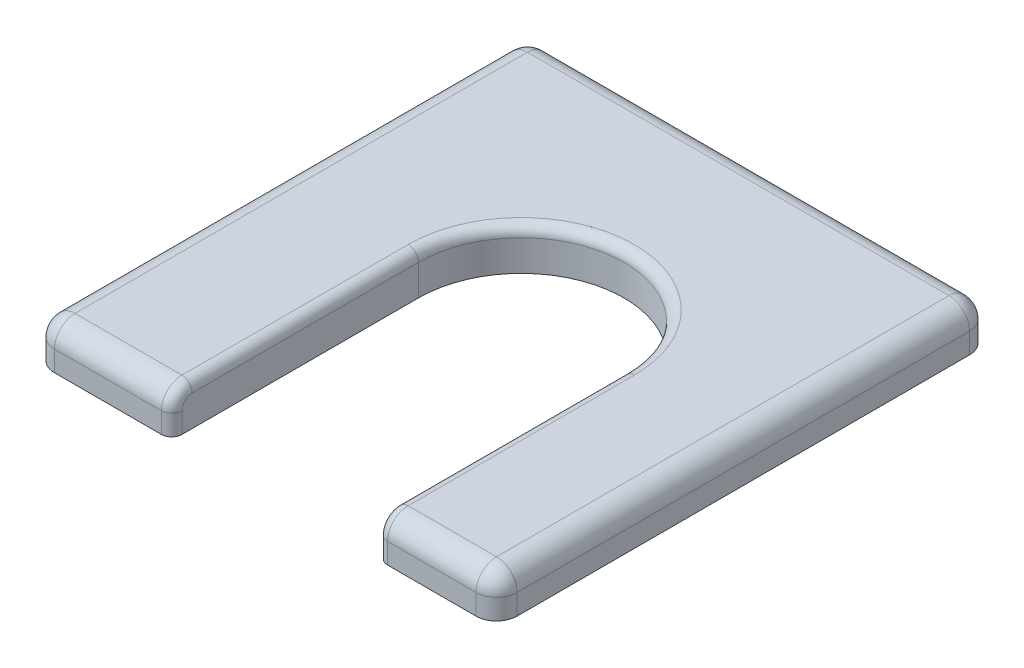
ISO-10303-21;
HEADER;
FILE_DESCRIPTION(('STEP AP214'),'2;1');
FILE_NAME('part.step','',(''),(''),'','','');
FILE_SCHEMA(('AUTOMOTIVE_DESIGN { 1 0 10303 214 1 1 1 1 }'));
ENDSEC;
DATA;
#1=APPLICATION_CONTEXT('core data for automotive mechanical design processes');
#2=APPLICATION_PROTOCOL_DEFINITION('international standard','automotive_design',2000,#1);
#3=PRODUCT_CONTEXT('',#1,'mechanical');
#4=PRODUCT('Part','Part','',(#3));
#5=PRODUCT_RELATED_PRODUCT_CATEGORY('part','',(#4));
#6=PRODUCT_DEFINITION_FORMATION('','',#4);
#7=PRODUCT_DEFINITION_CONTEXT('part definition',#1,'design');
#8=PRODUCT_DEFINITION('design','',#6,#7);
#9=PRODUCT_DEFINITION_SHAPE('','',#8);
#10=(LENGTH_UNIT() NAMED_UNIT(*) SI_UNIT(.MILLI.,.METRE.));
#11=(NAMED_UNIT(*) PLANE_ANGLE_UNIT() SI_UNIT($,.RADIAN.));
#12=(NAMED_UNIT(*) SI_UNIT($,.STERADIAN.) SOLID_ANGLE_UNIT());
#13=UNCERTAINTY_MEASURE_WITH_UNIT(LENGTH_MEASURE(1.E-05),#10,'distance_accuracy_value','');
#14=(GEOMETRIC_REPRESENTATION_CONTEXT(3) GLOBAL_UNCERTAINTY_ASSIGNED_CONTEXT((#13)) GLOBAL_UNIT_ASSIGNED_CONTEXT((#10,
#11,#12)) REPRESENTATION_CONTEXT('',''));
#15=CARTESIAN_POINT('',(0.,0.,0.));
#16=DIRECTION('',(0.,0.,1.));
#17=DIRECTION('',(1.,0.,0.));
#18=AXIS2_PLACEMENT_3D('',#15,#16,#17);
#19=CARTESIAN_POINT('',(0.,5.08,0.));
#20=DIRECTION('',(0.,0.,-1.));
#21=DIRECTION('',(-1.,0.,0.));
#22=AXIS2_PLACEMENT_3D('',#19,#20,#21);
#23=PLANE('',#22);
#24=DIRECTION('',(1.,0.,0.));
#25=VECTOR('',#24,1.);
#26=CARTESIAN_POINT('',(0.,0.,0.));
#27=LINE('',#26,#25);
#28=CARTESIAN_POINT('',(2.54,0.,0.));
#29=VERTEX_POINT('',#28);
#30=CARTESIAN_POINT('',(15.748,0.,0.));
#31=VERTEX_POINT('',#30);
#32=EDGE_CURVE('E212',#29,#31,#27,.T.);
#33=ORIENTED_EDGE('',*,*,#32,.T.);
#34=DIRECTION('',(0.,1.,0.));
#35=VECTOR('',#34,1.);
#36=CARTESIAN_POINT('',(15.748,5.08,0.));
#37=LINE('',#36,#35);
#38=CARTESIAN_POINT('',(15.748,2.54,0.));
#39=VERTEX_POINT('',#38);
#40=EDGE_CURVE('E363',#31,#39,#37,.T.);
#41=ORIENTED_EDGE('',*,*,#40,.T.);
#42=DIRECTION('',(1.,0.,0.));
#43=VECTOR('',#42,1.);
#44=CARTESIAN_POINT('',(0.,2.54,0.));
#45=LINE('',#44,#43);
#46=CARTESIAN_POINT('',(2.54,2.54,0.));
#47=VERTEX_POINT('',#46);
#48=EDGE_CURVE('E252',#39,#47,#45,.F.);
#49=ORIENTED_EDGE('',*,*,#48,.T.);
#50=DIRECTION('',(0.,-1.,0.));
#51=VECTOR('',#50,1.);
#52=CARTESIAN_POINT('',(2.54,5.08,0.));
#53=LINE('',#52,#51);
#54=EDGE_CURVE('E257',#47,#29,#53,.T.);
#55=ORIENTED_EDGE('',*,*,#54,.T.);
#56=EDGE_LOOP('',(#33,#41,#49,#55));
#57=FACE_BOUND('',#56,.T.);
#58=ADVANCED_FACE('F41',(#57),#23,.F.);
#59=CARTESIAN_POINT('',(0.,2.54,-2.54));
#60=DIRECTION('',(1.,0.,0.));
#61=DIRECTION('',(0.,0.,-1.));
#62=AXIS2_PLACEMENT_3D('',#59,#60,#61);
#63=CYLINDRICAL_SURFACE('',#62,2.54);
#64=ORIENTED_EDGE('',*,*,#48,.F.);
#65=CARTESIAN_POINT('',(15.748,2.54,-2.54));
#66=DIRECTION('',(-1.,0.,0.));
#67=DIRECTION('',(0.,0.,1.));
#68=AXIS2_PLACEMENT_3D('',#65,#66,#67);
#69=CIRCLE('',#68,2.54);
#70=CARTESIAN_POINT('',(15.748,5.08,-2.54));
#71=VERTEX_POINT('',#70);
#72=EDGE_CURVE('E51',#39,#71,#69,.T.);
#73=ORIENTED_EDGE('',*,*,#72,.T.);
#74=DIRECTION('',(1.,0.,0.));
#75=VECTOR('',#74,1.);
#76=CARTESIAN_POINT('',(0.,5.08,-2.54));
#77=LINE('',#76,#75);
#78=CARTESIAN_POINT('',(2.54,5.08,-2.54));
#79=VERTEX_POINT('',#78);
#80=EDGE_CURVE('E231',#79,#71,#77,.T.);
#81=ORIENTED_EDGE('',*,*,#80,.F.);
#82=CARTESIAN_POINT('',(2.54,2.54,-2.54));
#83=DIRECTION('',(-1.,0.,0.));
#84=DIRECTION('',(0.,0.,1.));
#85=AXIS2_PLACEMENT_3D('',#82,#83,#84);
#86=CIRCLE('',#85,2.54);
#87=EDGE_CURVE('E300',#47,#79,#86,.T.);
#88=ORIENTED_EDGE('',*,*,#87,.F.);
#89=EDGE_LOOP('',(#64,#73,#81,#88));
#90=FACE_BOUND('',#89,.T.);
#91=ADVANCED_FACE('F411',(#90),#63,.T.);
#92=CARTESIAN_POINT('',(0.,5.08,0.));
#93=DIRECTION('',(1.,0.,0.));
#94=DIRECTION('',(0.,0.,-1.));
#95=AXIS2_PLACEMENT_3D('',#92,#93,#94);
#96=PLANE('',#95);
#97=DIRECTION('',(0.,0.,1.));
#98=VECTOR('',#97,1.);
#99=CARTESIAN_POINT('',(0.,0.,0.));
#100=LINE('',#99,#98);
#101=CARTESIAN_POINT('',(0.,0.,-58.42));
#102=VERTEX_POINT('',#101);
#103=CARTESIAN_POINT('',(0.,0.,-2.54));
#104=VERTEX_POINT('',#103);
#105=EDGE_CURVE('E206',#102,#104,#100,.T.);
#106=ORIENTED_EDGE('',*,*,#105,.T.);
#107=DIRECTION('',(0.,-1.,0.));
#108=VECTOR('',#107,1.);
#109=CARTESIAN_POINT('',(0.,5.08,-2.54));
#110=LINE('',#109,#108);
#111=CARTESIAN_POINT('',(0.,2.54,-2.54));
#112=VERTEX_POINT('',#111);
#113=EDGE_CURVE('E246',#104,#112,#110,.F.);
#114=ORIENTED_EDGE('',*,*,#113,.T.);
#115=DIRECTION('',(0.,0.,1.));
#116=VECTOR('',#115,1.);
#117=CARTESIAN_POINT('',(0.,2.54,0.));
#118=LINE('',#117,#116);
#119=CARTESIAN_POINT('',(0.,2.54,-58.42));
#120=VERTEX_POINT('',#119);
#121=EDGE_CURVE('E242',#112,#120,#118,.F.);
#122=ORIENTED_EDGE('',*,*,#121,.T.);
#123=DIRECTION('',(0.,-1.,0.));
#124=VECTOR('',#123,1.);
#125=CARTESIAN_POINT('',(0.,5.08,-58.42));
#126=LINE('',#125,#124);
#127=EDGE_CURVE('E239',#120,#102,#126,.T.);
#128=ORIENTED_EDGE('',*,*,#127,.T.);
#129=EDGE_LOOP('',(#106,#114,#122,#128));
#130=FACE_BOUND('',#129,.T.);
#131=ADVANCED_FACE('F467',(#130),#96,.F.);
#132=CARTESIAN_POINT('',(54.61,2.54,0.));
#133=VERTEX_POINT('',#132);
#134=CARTESIAN_POINT('',(43.688,2.54,0.));
#135=VERTEX_POINT('',#134);
#136=EDGE_CURVE('E253',#133,#135,#45,.F.);
#137=ORIENTED_EDGE('',*,*,#136,.T.);
#138=DIRECTION('',(0.,1.,0.));
#139=VECTOR('',#138,1.);
#140=CARTESIAN_POINT('',(43.688,5.08,0.));
#141=LINE('',#140,#139);
#142=CARTESIAN_POINT('',(43.688,0.,0.));
#143=VERTEX_POINT('',#142);
#144=EDGE_CURVE('E343',#135,#143,#141,.F.);
#145=ORIENTED_EDGE('',*,*,#144,.T.);
#146=CARTESIAN_POINT('',(54.61,0.,0.));
#147=VERTEX_POINT('',#146);
#148=EDGE_CURVE('E210',#143,#147,#27,.T.);
#149=ORIENTED_EDGE('',*,*,#148,.T.);
#150=DIRECTION('',(0.,-1.,0.));
#151=VECTOR('',#150,1.);
#152=CARTESIAN_POINT('',(54.61,5.08,0.));
#153=LINE('',#152,#151);
#154=EDGE_CURVE('E249',#147,#133,#153,.F.);
#155=ORIENTED_EDGE('',*,*,#154,.T.);
#156=EDGE_LOOP('',(#137,#145,#149,#155));
#157=FACE_BOUND('',#156,.T.);
#158=ADVANCED_FACE('F417',(#157),#23,.F.);
#159=CARTESIAN_POINT('',(57.15,5.08,0.));
#160=DIRECTION('',(-1.,0.,0.));
#161=DIRECTION('',(0.,0.,1.));
#162=AXIS2_PLACEMENT_3D('',#159,#160,#161);
#163=PLANE('',#162);
#164=DIRECTION('',(0.,0.,-1.));
#165=VECTOR('',#164,1.);
#166=CARTESIAN_POINT('',(57.15,2.54,0.));
#167=LINE('',#166,#165);
#168=CARTESIAN_POINT('',(57.15,2.54,-58.42));
#169=VERTEX_POINT('',#168);
#170=CARTESIAN_POINT('',(57.15,2.54,-2.54));
#171=VERTEX_POINT('',#170);
#172=EDGE_CURVE('E276',#169,#171,#167,.F.);
#173=ORIENTED_EDGE('',*,*,#172,.T.);
#174=DIRECTION('',(0.,-1.,0.));
#175=VECTOR('',#174,1.);
#176=CARTESIAN_POINT('',(57.15,5.08,-2.54));
#177=LINE('',#176,#175);
#178=CARTESIAN_POINT('',(57.15,0.,-2.54));
#179=VERTEX_POINT('',#178);
#180=EDGE_CURVE('E279',#171,#179,#177,.T.);
#181=ORIENTED_EDGE('',*,*,#180,.T.);
#182=DIRECTION('',(0.,0.,-1.));
#183=VECTOR('',#182,1.);
#184=CARTESIAN_POINT('',(57.15,0.,0.));
#185=LINE('',#184,#183);
#186=CARTESIAN_POINT('',(57.15,0.,-58.42));
#187=VERTEX_POINT('',#186);
#188=EDGE_CURVE('E216',#179,#187,#185,.T.);
#189=ORIENTED_EDGE('',*,*,#188,.T.);
#190=DIRECTION('',(0.,-1.,0.));
#191=VECTOR('',#190,1.);
#192=CARTESIAN_POINT('',(57.15,5.08,-58.42));
#193=LINE('',#192,#191);
#194=EDGE_CURVE('E273',#187,#169,#193,.F.);
#195=ORIENTED_EDGE('',*,*,#194,.T.);
#196=EDGE_LOOP('',(#173,#181,#189,#195));
#197=FACE_BOUND('',#196,.T.);
#198=ADVANCED_FACE('F472',(#197),#163,.F.);
#199=CARTESIAN_POINT('',(0.,5.08,-60.96));
#200=DIRECTION('',(0.,0.,1.));
#201=DIRECTION('',(1.,0.,0.));
#202=AXIS2_PLACEMENT_3D('',#199,#200,#201);
#203=PLANE('',#202);
#204=DIRECTION('',(-1.,0.,0.));
#205=VECTOR('',#204,1.);
#206=CARTESIAN_POINT('',(0.,2.54,-60.96));
#207=LINE('',#206,#205);
#208=CARTESIAN_POINT('',(2.54,2.54,-60.96));
#209=VERTEX_POINT('',#208);
#210=CARTESIAN_POINT('',(54.61,2.54,-60.96));
#211=VERTEX_POINT('',#210);
#212=EDGE_CURVE('E285',#209,#211,#207,.F.);
#213=ORIENTED_EDGE('',*,*,#212,.T.);
#214=DIRECTION('',(0.,-1.,0.));
#215=VECTOR('',#214,1.);
#216=CARTESIAN_POINT('',(54.61,5.08,-60.96));
#217=LINE('',#216,#215);
#218=CARTESIAN_POINT('',(54.61,0.,-60.96));
#219=VERTEX_POINT('',#218);
#220=EDGE_CURVE('E288',#211,#219,#217,.T.);
#221=ORIENTED_EDGE('',*,*,#220,.T.);
#222=DIRECTION('',(-1.,0.,0.));
#223=VECTOR('',#222,1.);
#224=CARTESIAN_POINT('',(0.,0.,-60.96));
#225=LINE('',#224,#223);
#226=CARTESIAN_POINT('',(2.54,0.,-60.96));
#227=VERTEX_POINT('',#226);
#228=EDGE_CURVE('E220',#219,#227,#225,.T.);
#229=ORIENTED_EDGE('',*,*,#228,.T.);
#230=DIRECTION('',(0.,-1.,0.));
#231=VECTOR('',#230,1.);
#232=CARTESIAN_POINT('',(2.54,5.08,-60.96));
#233=LINE('',#232,#231);
#234=EDGE_CURVE('E282',#227,#209,#233,.F.);
#235=ORIENTED_EDGE('',*,*,#234,.T.);
#236=EDGE_LOOP('',(#213,#221,#229,#235));
#237=FACE_BOUND('',#236,.T.);
#238=ADVANCED_FACE('F477',(#237),#203,.F.);
#239=CARTESIAN_POINT('',(0.,5.08,0.));
#240=DIRECTION('',(0.,-1.,0.));
#241=DIRECTION('',(0.,0.,-1.));
#242=AXIS2_PLACEMENT_3D('',#239,#240,#241);
#243=PLANE('',#242);
#244=CARTESIAN_POINT('',(29.718,5.08,-30.48));
#245=DIRECTION('',(0.,-1.,0.));
#246=DIRECTION('',(0.,0.,-1.));
#247=AXIS2_PLACEMENT_3D('',#244,#245,#246);
#248=CIRCLE('',#247,13.97);
#249=CARTESIAN_POINT('',(15.748,5.08,-30.48));
#250=VERTEX_POINT('',#249);
#251=CARTESIAN_POINT('',(43.688,5.08,-30.48));
#252=VERTEX_POINT('',#251);
#253=EDGE_CURVE('E354',#250,#252,#248,.T.);
#254=ORIENTED_EDGE('',*,*,#253,.T.);
#255=DIRECTION('',(0.,0.,-1.));
#256=VECTOR('',#255,1.);
#257=CARTESIAN_POINT('',(43.688,5.08,0.));
#258=LINE('',#257,#256);
#259=CARTESIAN_POINT('',(43.688,5.08,-2.54));
#260=VERTEX_POINT('',#259);
#261=EDGE_CURVE('E360',#252,#260,#258,.F.);
#262=ORIENTED_EDGE('',*,*,#261,.T.);
#263=CARTESIAN_POINT('',(54.61,5.08,-2.54));
#264=VERTEX_POINT('',#263);
#265=EDGE_CURVE('E230',#260,#264,#77,.T.);
#266=ORIENTED_EDGE('',*,*,#265,.T.);
#267=DIRECTION('',(0.,0.,-1.));
#268=VECTOR('',#267,1.);
#269=CARTESIAN_POINT('',(54.61,5.08,0.));
#270=LINE('',#269,#268);
#271=CARTESIAN_POINT('',(54.61,5.08,-58.42));
#272=VERTEX_POINT('',#271);
#273=EDGE_CURVE('E227',#264,#272,#270,.T.);
#274=ORIENTED_EDGE('',*,*,#273,.T.);
#275=DIRECTION('',(-1.,0.,0.));
#276=VECTOR('',#275,1.);
#277=CARTESIAN_POINT('',(0.,5.08,-58.42));
#278=LINE('',#277,#276);
#279=CARTESIAN_POINT('',(2.54,5.08,-58.42));
#280=VERTEX_POINT('',#279);
#281=EDGE_CURVE('E224',#272,#280,#278,.T.);
#282=ORIENTED_EDGE('',*,*,#281,.T.);
#283=DIRECTION('',(0.,0.,1.));
#284=VECTOR('',#283,1.);
#285=CARTESIAN_POINT('',(2.54,5.08,0.));
#286=LINE('',#285,#284);
#287=EDGE_CURVE('E235',#280,#79,#286,.T.);
#288=ORIENTED_EDGE('',*,*,#287,.T.);
#289=ORIENTED_EDGE('',*,*,#80,.T.);
#290=DIRECTION('',(0.,0.,1.));
#291=VECTOR('',#290,1.);
#292=CARTESIAN_POINT('',(15.748,5.08,0.));
#293=LINE('',#292,#291);
#294=EDGE_CURVE('E357',#71,#250,#293,.F.);
#295=ORIENTED_EDGE('',*,*,#294,.T.);
#296=EDGE_LOOP('',(#254,#262,#266,#274,#282,#288,#289,#295));
#297=FACE_BOUND('',#296,.T.);
#298=ADVANCED_FACE('F453',(#297),#243,.F.);
#299=CARTESIAN_POINT('',(0.,0.,0.));
#300=DIRECTION('',(0.,-1.,0.));
#301=DIRECTION('',(0.,0.,-1.));
#302=AXIS2_PLACEMENT_3D('',#299,#300,#301);
#303=PLANE('',#302);
#304=ORIENTED_EDGE('',*,*,#148,.F.);
#305=CARTESIAN_POINT('',(43.688,0.,-1.27));
#306=DIRECTION('',(0.,-1.,0.));
#307=DIRECTION('',(0.,0.,-1.));
#308=AXIS2_PLACEMENT_3D('',#305,#306,#307);
#309=CIRCLE('',#308,1.27);
#310=CARTESIAN_POINT('',(42.418,0.,-1.27));
#311=VERTEX_POINT('',#310);
#312=EDGE_CURVE('E180',#143,#311,#309,.T.);
#313=ORIENTED_EDGE('',*,*,#312,.T.);
#314=DIRECTION('',(0.,0.,-1.));
#315=VECTOR('',#314,1.);
#316=CARTESIAN_POINT('',(42.418,0.,0.));
#317=LINE('',#316,#315);
#318=CARTESIAN_POINT('',(42.418,0.,-30.48));
#319=VERTEX_POINT('',#318);
#320=EDGE_CURVE('E173',#311,#319,#317,.T.);
#321=ORIENTED_EDGE('',*,*,#320,.T.);
#322=CARTESIAN_POINT('',(29.718,0.,-30.48));
#323=DIRECTION('',(0.,-1.,0.));
#324=DIRECTION('',(0.,0.,-1.));
#325=AXIS2_PLACEMENT_3D('',#322,#323,#324);
#326=CIRCLE('',#325,12.7);
#327=CARTESIAN_POINT('',(17.018,0.,-30.48));
#328=VERTEX_POINT('',#327);
#329=EDGE_CURVE('E178',#319,#328,#326,.F.);
#330=ORIENTED_EDGE('',*,*,#329,.T.);
#331=DIRECTION('',(0.,0.,1.));
#332=VECTOR('',#331,1.);
#333=CARTESIAN_POINT('',(17.018,0.,-30.48));
#334=LINE('',#333,#332);
#335=CARTESIAN_POINT('',(17.018,0.,-1.27));
#336=VERTEX_POINT('',#335);
#337=EDGE_CURVE('E187',#328,#336,#334,.T.);
#338=ORIENTED_EDGE('',*,*,#337,.T.);
#339=CARTESIAN_POINT('',(15.748,0.,-1.27));
#340=DIRECTION('',(0.,-1.,0.));
#341=DIRECTION('',(0.,0.,-1.));
#342=AXIS2_PLACEMENT_3D('',#339,#340,#341);
#343=CIRCLE('',#342,1.27);
#344=EDGE_CURVE('E346',#336,#31,#343,.T.);
#345=ORIENTED_EDGE('',*,*,#344,.T.);
#346=ORIENTED_EDGE('',*,*,#32,.F.);
#347=CARTESIAN_POINT('',(2.54,0.,-2.54));
#348=DIRECTION('',(0.,-1.,0.));
#349=DIRECTION('',(0.,0.,-1.));
#350=AXIS2_PLACEMENT_3D('',#347,#348,#349);
#351=CIRCLE('',#350,2.54);
#352=EDGE_CURVE('E270',#29,#104,#351,.T.);
#353=ORIENTED_EDGE('',*,*,#352,.T.);
#354=ORIENTED_EDGE('',*,*,#105,.F.);
#355=CARTESIAN_POINT('',(2.54,0.,-58.42));
#356=DIRECTION('',(0.,-1.,0.));
#357=DIRECTION('',(0.,0.,-1.));
#358=AXIS2_PLACEMENT_3D('',#355,#356,#357);
#359=CIRCLE('',#358,2.54);
#360=EDGE_CURVE('E260',#102,#227,#359,.T.);
#361=ORIENTED_EDGE('',*,*,#360,.T.);
#362=ORIENTED_EDGE('',*,*,#228,.F.);
#363=CARTESIAN_POINT('',(54.61,0.,-58.42));
#364=DIRECTION('',(0.,-1.,0.));
#365=DIRECTION('',(0.,0.,-1.));
#366=AXIS2_PLACEMENT_3D('',#363,#364,#365);
#367=CIRCLE('',#366,2.54);
#368=EDGE_CURVE('E263',#219,#187,#367,.T.);
#369=ORIENTED_EDGE('',*,*,#368,.T.);
#370=ORIENTED_EDGE('',*,*,#188,.F.);
#371=CARTESIAN_POINT('',(54.61,0.,-2.54));
#372=DIRECTION('',(0.,-1.,0.));
#373=DIRECTION('',(0.,0.,-1.));
#374=AXIS2_PLACEMENT_3D('',#371,#372,#373);
#375=CIRCLE('',#374,2.54);
#376=EDGE_CURVE('E266',#179,#147,#375,.T.);
#377=ORIENTED_EDGE('',*,*,#376,.T.);
#378=EDGE_LOOP('',(#304,#313,#321,#330,#338,#345,#346,#353,#354,#361,#362,#369,#370,#377));
#379=FACE_BOUND('',#378,.T.);
#380=ADVANCED_FACE('F176',(#379),#303,.T.);
#381=CARTESIAN_POINT('',(54.61,5.08,-58.42));
#382=DIRECTION('',(0.,-1.,0.));
#383=DIRECTION('',(0.,0.,-1.));
#384=AXIS2_PLACEMENT_3D('',#381,#382,#383);
#385=CYLINDRICAL_SURFACE('',#384,2.54);
#386=ORIENTED_EDGE('',*,*,#368,.F.);
#387=ORIENTED_EDGE('',*,*,#220,.F.);
#388=CARTESIAN_POINT('',(54.61,2.54,-58.42));
#389=DIRECTION('',(0.,1.,0.));
#390=DIRECTION('',(0.,0.,1.));
#391=AXIS2_PLACEMENT_3D('',#388,#389,#390);
#392=CIRCLE('',#391,2.54);
#393=EDGE_CURVE('E211',#169,#211,#392,.T.);
#394=ORIENTED_EDGE('',*,*,#393,.F.);
#395=ORIENTED_EDGE('',*,*,#194,.F.);
#396=EDGE_LOOP('',(#386,#387,#394,#395));
#397=FACE_BOUND('',#396,.T.);
#398=ADVANCED_FACE('F519',(#397),#385,.T.);
#399=CARTESIAN_POINT('',(54.61,2.54,0.));
#400=DIRECTION('',(0.,0.,-1.));
#401=DIRECTION('',(-1.,0.,0.));
#402=AXIS2_PLACEMENT_3D('',#399,#400,#401);
#403=CYLINDRICAL_SURFACE('',#402,2.54);
#404=CARTESIAN_POINT('',(54.61,2.54,-2.54));
#405=DIRECTION('',(0.,0.,1.));
#406=DIRECTION('',(1.,0.,0.));
#407=AXIS2_PLACEMENT_3D('',#404,#405,#406);
#408=CIRCLE('',#407,2.54);
#409=EDGE_CURVE('E324',#171,#264,#408,.T.);
#410=ORIENTED_EDGE('',*,*,#409,.F.);
#411=ORIENTED_EDGE('',*,*,#172,.F.);
#412=CARTESIAN_POINT('',(54.61,2.54,-58.42));
#413=DIRECTION('',(0.,0.,-1.));
#414=DIRECTION('',(-1.,0.,0.));
#415=AXIS2_PLACEMENT_3D('',#412,#413,#414);
#416=CIRCLE('',#415,2.54);
#417=EDGE_CURVE('E328',#272,#169,#416,.T.);
#418=ORIENTED_EDGE('',*,*,#417,.F.);
#419=ORIENTED_EDGE('',*,*,#273,.F.);
#420=EDGE_LOOP('',(#410,#411,#418,#419));
#421=FACE_BOUND('',#420,.T.);
#422=ADVANCED_FACE('F516',(#421),#403,.T.);
#423=CARTESIAN_POINT('',(54.61,5.08,-2.54));
#424=DIRECTION('',(0.,-1.,0.));
#425=DIRECTION('',(0.,0.,-1.));
#426=AXIS2_PLACEMENT_3D('',#423,#424,#425);
#427=CYLINDRICAL_SURFACE('',#426,2.54);
#428=ORIENTED_EDGE('',*,*,#376,.F.);
#429=ORIENTED_EDGE('',*,*,#180,.F.);
#430=CARTESIAN_POINT('',(54.61,2.54,-2.54));
#431=DIRECTION('',(0.,1.,0.));
#432=DIRECTION('',(0.,0.,1.));
#433=AXIS2_PLACEMENT_3D('',#430,#431,#432);
#434=CIRCLE('',#433,2.54);
#435=EDGE_CURVE('E320',#133,#171,#434,.T.);
#436=ORIENTED_EDGE('',*,*,#435,.F.);
#437=ORIENTED_EDGE('',*,*,#154,.F.);
#438=EDGE_LOOP('',(#428,#429,#436,#437));
#439=FACE_BOUND('',#438,.T.);
#440=ADVANCED_FACE('F425',(#439),#427,.T.);
#441=CARTESIAN_POINT('',(54.61,2.54,-58.42));
#442=DIRECTION('',(1.,0.,0.));
#443=DIRECTION('',(0.,0.,-1.));
#444=AXIS2_PLACEMENT_3D('',#441,#442,#443);
#445=SPHERICAL_SURFACE('',#444,2.54);
#446=ORIENTED_EDGE('',*,*,#417,.T.);
#447=ORIENTED_EDGE('',*,*,#393,.T.);
#448=CARTESIAN_POINT('',(54.61,2.54,-58.42));
#449=DIRECTION('',(1.,0.,0.));
#450=DIRECTION('',(0.,0.,-1.));
#451=AXIS2_PLACEMENT_3D('',#448,#449,#450);
#452=CIRCLE('',#451,2.54);
#453=EDGE_CURVE('E316',#272,#211,#452,.F.);
#454=ORIENTED_EDGE('',*,*,#453,.F.);
#455=EDGE_LOOP('',(#446,#447,#454));
#456=FACE_BOUND('',#455,.T.);
#457=ADVANCED_FACE('F510',(#456),#445,.T.);
#458=CARTESIAN_POINT('',(54.61,2.54,-2.54));
#459=DIRECTION('',(1.,0.,0.));
#460=DIRECTION('',(0.,0.,-1.));
#461=AXIS2_PLACEMENT_3D('',#458,#459,#460);
#462=SPHERICAL_SURFACE('',#461,2.54);
#463=ORIENTED_EDGE('',*,*,#435,.T.);
#464=ORIENTED_EDGE('',*,*,#409,.T.);
#465=CARTESIAN_POINT('',(54.61,2.54,-2.54));
#466=DIRECTION('',(1.,0.,0.));
#467=DIRECTION('',(0.,0.,-1.));
#468=AXIS2_PLACEMENT_3D('',#465,#466,#467);
#469=CIRCLE('',#468,2.54);
#470=EDGE_CURVE('E312',#133,#264,#469,.F.);
#471=ORIENTED_EDGE('',*,*,#470,.F.);
#472=EDGE_LOOP('',(#463,#464,#471));
#473=FACE_BOUND('',#472,.T.);
#474=ADVANCED_FACE('F430',(#473),#462,.T.);
#475=CARTESIAN_POINT('',(2.54,5.08,-58.42));
#476=DIRECTION('',(0.,-1.,0.));
#477=DIRECTION('',(0.,0.,-1.));
#478=AXIS2_PLACEMENT_3D('',#475,#476,#477);
#479=CYLINDRICAL_SURFACE('',#478,2.54);
#480=ORIENTED_EDGE('',*,*,#360,.F.);
#481=ORIENTED_EDGE('',*,*,#127,.F.);
#482=CARTESIAN_POINT('',(2.54,2.54,-58.42));
#483=DIRECTION('',(0.,1.,0.));
#484=DIRECTION('',(0.,0.,1.));
#485=AXIS2_PLACEMENT_3D('',#482,#483,#484);
#486=CIRCLE('',#485,2.54);
#487=EDGE_CURVE('E308',#209,#120,#486,.T.);
#488=ORIENTED_EDGE('',*,*,#487,.F.);
#489=ORIENTED_EDGE('',*,*,#234,.F.);
#490=EDGE_LOOP('',(#480,#481,#488,#489));
#491=FACE_BOUND('',#490,.T.);
#492=ADVANCED_FACE('F503',(#491),#479,.T.);
#493=CARTESIAN_POINT('',(0.,2.54,-58.42));
#494=DIRECTION('',(-1.,0.,0.));
#495=DIRECTION('',(0.,0.,1.));
#496=AXIS2_PLACEMENT_3D('',#493,#494,#495);
#497=CYLINDRICAL_SURFACE('',#496,2.54);
#498=ORIENTED_EDGE('',*,*,#453,.T.);
#499=ORIENTED_EDGE('',*,*,#212,.F.);
#500=CARTESIAN_POINT('',(2.54,2.54,-58.42));
#501=DIRECTION('',(-1.,0.,0.));
#502=DIRECTION('',(0.,0.,1.));
#503=AXIS2_PLACEMENT_3D('',#500,#501,#502);
#504=CIRCLE('',#503,2.54);
#505=EDGE_CURVE('E304',#280,#209,#504,.T.);
#506=ORIENTED_EDGE('',*,*,#505,.F.);
#507=ORIENTED_EDGE('',*,*,#281,.F.);
#508=EDGE_LOOP('',(#498,#499,#506,#507));
#509=FACE_BOUND('',#508,.T.);
#510=ADVANCED_FACE('F500',(#509),#497,.T.);
#511=ORIENTED_EDGE('',*,*,#265,.F.);
#512=CARTESIAN_POINT('',(43.688,2.54,-2.54));
#513=DIRECTION('',(1.,0.,0.));
#514=DIRECTION('',(0.,0.,-1.));
#515=AXIS2_PLACEMENT_3D('',#512,#513,#514);
#516=CIRCLE('',#515,2.54);
#517=EDGE_CURVE('E351',#260,#135,#516,.T.);
#518=ORIENTED_EDGE('',*,*,#517,.T.);
#519=ORIENTED_EDGE('',*,*,#136,.F.);
#520=ORIENTED_EDGE('',*,*,#470,.T.);
#521=EDGE_LOOP('',(#511,#518,#519,#520));
#522=FACE_BOUND('',#521,.T.);
#523=ADVANCED_FACE('F433',(#522),#63,.T.);
#524=CARTESIAN_POINT('',(2.54,5.08,-2.54));
#525=DIRECTION('',(0.,-1.,0.));
#526=DIRECTION('',(0.,0.,-1.));
#527=AXIS2_PLACEMENT_3D('',#524,#525,#526);
#528=CYLINDRICAL_SURFACE('',#527,2.54);
#529=ORIENTED_EDGE('',*,*,#352,.F.);
#530=ORIENTED_EDGE('',*,*,#54,.F.);
#531=CARTESIAN_POINT('',(2.54,2.54,-2.54));
#532=DIRECTION('',(0.,1.,0.));
#533=DIRECTION('',(0.,0.,1.));
#534=AXIS2_PLACEMENT_3D('',#531,#532,#533);
#535=CIRCLE('',#534,2.54);
#536=EDGE_CURVE('E296',#112,#47,#535,.T.);
#537=ORIENTED_EDGE('',*,*,#536,.F.);
#538=ORIENTED_EDGE('',*,*,#113,.F.);
#539=EDGE_LOOP('',(#529,#530,#537,#538));
#540=FACE_BOUND('',#539,.T.);
#541=ADVANCED_FACE('F494',(#540),#528,.T.);
#542=CARTESIAN_POINT('',(2.54,2.54,-58.42));
#543=DIRECTION('',(0.,0.,-1.));
#544=DIRECTION('',(-1.,0.,0.));
#545=AXIS2_PLACEMENT_3D('',#542,#543,#544);
#546=SPHERICAL_SURFACE('',#545,2.54);
#547=ORIENTED_EDGE('',*,*,#505,.T.);
#548=ORIENTED_EDGE('',*,*,#487,.T.);
#549=CARTESIAN_POINT('',(2.54,2.54,-58.42));
#550=DIRECTION('',(0.,0.,-1.));
#551=DIRECTION('',(-1.,0.,0.));
#552=AXIS2_PLACEMENT_3D('',#549,#550,#551);
#553=CIRCLE('',#552,2.54);
#554=EDGE_CURVE('E293',#280,#120,#553,.F.);
#555=ORIENTED_EDGE('',*,*,#554,.F.);
#556=EDGE_LOOP('',(#547,#548,#555));
#557=FACE_BOUND('',#556,.T.);
#558=ADVANCED_FACE('F490',(#557),#546,.T.);
#559=CARTESIAN_POINT('',(2.54,2.54,-2.54));
#560=DIRECTION('',(0.,0.,1.));
#561=DIRECTION('',(1.,0.,0.));
#562=AXIS2_PLACEMENT_3D('',#559,#560,#561);
#563=SPHERICAL_SURFACE('',#562,2.54);
#564=ORIENTED_EDGE('',*,*,#536,.T.);
#565=ORIENTED_EDGE('',*,*,#87,.T.);
#566=CARTESIAN_POINT('',(2.54,2.54,-2.54));
#567=DIRECTION('',(0.,0.,1.));
#568=DIRECTION('',(1.,0.,0.));
#569=AXIS2_PLACEMENT_3D('',#566,#567,#568);
#570=CIRCLE('',#569,2.54);
#571=EDGE_CURVE('E205',#112,#79,#570,.F.);
#572=ORIENTED_EDGE('',*,*,#571,.F.);
#573=EDGE_LOOP('',(#564,#565,#572));
#574=FACE_BOUND('',#573,.T.);
#575=ADVANCED_FACE('F486',(#574),#563,.T.);
#576=CARTESIAN_POINT('',(2.54,2.54,0.));
#577=DIRECTION('',(0.,0.,1.));
#578=DIRECTION('',(1.,0.,0.));
#579=AXIS2_PLACEMENT_3D('',#576,#577,#578);
#580=CYLINDRICAL_SURFACE('',#579,2.54);
#581=ORIENTED_EDGE('',*,*,#554,.T.);
#582=ORIENTED_EDGE('',*,*,#121,.F.);
#583=ORIENTED_EDGE('',*,*,#571,.T.);
#584=ORIENTED_EDGE('',*,*,#287,.F.);
#585=EDGE_LOOP('',(#581,#582,#583,#584));
#586=FACE_BOUND('',#585,.T.);
#587=ADVANCED_FACE('F483',(#586),#580,.T.);
#588=CARTESIAN_POINT('',(17.018,-50.0966306252227,-30.48));
#589=DIRECTION('',(-1.,0.,0.));
#590=DIRECTION('',(0.,0.,1.));
#591=AXIS2_PLACEMENT_3D('',#588,#589,#590);
#592=PLANE('',#591);
#593=CARTESIAN_POINT('',(17.018,2.54,-2.54));
#594=DIRECTION('',(-1.,0.,0.));
#595=DIRECTION('',(0.,0.,1.));
#596=AXIS2_PLACEMENT_3D('',#593,#594,#595);
#597=CIRCLE('',#596,1.27);
#598=CARTESIAN_POINT('',(17.018,3.81,-2.54));
#599=VERTEX_POINT('',#598);
#600=CARTESIAN_POINT('',(17.018,2.54,-1.27));
#601=VERTEX_POINT('',#600);
#602=EDGE_CURVE('E59',#599,#601,#597,.F.);
#603=ORIENTED_EDGE('',*,*,#602,.T.);
#604=DIRECTION('',(0.,1.,0.));
#605=VECTOR('',#604,1.);
#606=CARTESIAN_POINT('',(17.018,-50.0966306252227,-1.27));
#607=LINE('',#606,#605);
#608=EDGE_CURVE('E370',#601,#336,#607,.F.);
#609=ORIENTED_EDGE('',*,*,#608,.T.);
#610=ORIENTED_EDGE('',*,*,#337,.F.);
#611=DIRECTION('',(0.,1.,0.));
#612=VECTOR('',#611,1.);
#613=CARTESIAN_POINT('',(17.018,-50.0966306252227,-30.48));
#614=LINE('',#613,#612);
#615=CARTESIAN_POINT('',(17.018,3.80999999999999,-30.48));
#616=VERTEX_POINT('',#615);
#617=EDGE_CURVE('E194',#328,#616,#614,.T.);
#618=ORIENTED_EDGE('',*,*,#617,.T.);
#619=DIRECTION('',(0.,0.,1.));
#620=VECTOR('',#619,1.);
#621=CARTESIAN_POINT('',(17.018,3.81,-30.48));
#622=LINE('',#621,#620);
#623=EDGE_CURVE('E64',#616,#599,#622,.T.);
#624=ORIENTED_EDGE('',*,*,#623,.T.);
#625=EDGE_LOOP('',(#603,#609,#610,#618,#624));
#626=FACE_BOUND('',#625,.T.);
#627=ADVANCED_FACE('F450',(#626),#592,.F.);
#628=CARTESIAN_POINT('',(42.418,-50.0966306252227,0.));
#629=DIRECTION('',(1.,0.,0.));
#630=DIRECTION('',(0.,0.,-1.));
#631=AXIS2_PLACEMENT_3D('',#628,#629,#630);
#632=PLANE('',#631);
#633=ORIENTED_EDGE('',*,*,#320,.F.);
#634=DIRECTION('',(0.,1.,0.));
#635=VECTOR('',#634,1.);
#636=CARTESIAN_POINT('',(42.418,-50.0966306252227,-1.27));
#637=LINE('',#636,#635);
#638=CARTESIAN_POINT('',(42.418,2.54,-1.27));
#639=VERTEX_POINT('',#638);
#640=EDGE_CURVE('E340',#311,#639,#637,.T.);
#641=ORIENTED_EDGE('',*,*,#640,.T.);
#642=CARTESIAN_POINT('',(42.418,2.54,-2.54));
#643=DIRECTION('',(1.,0.,0.));
#644=DIRECTION('',(0.,0.,-1.));
#645=AXIS2_PLACEMENT_3D('',#642,#643,#644);
#646=CIRCLE('',#645,1.27);
#647=CARTESIAN_POINT('',(42.418,3.81,-2.54));
#648=VERTEX_POINT('',#647);
#649=EDGE_CURVE('E337',#639,#648,#646,.F.);
#650=ORIENTED_EDGE('',*,*,#649,.T.);
#651=DIRECTION('',(0.,0.,-1.));
#652=VECTOR('',#651,1.);
#653=CARTESIAN_POINT('',(42.418,3.81,0.));
#654=LINE('',#653,#652);
#655=CARTESIAN_POINT('',(42.418,3.80999999999999,-30.48));
#656=VERTEX_POINT('',#655);
#657=EDGE_CURVE('E199',#648,#656,#654,.T.);
#658=ORIENTED_EDGE('',*,*,#657,.T.);
#659=DIRECTION('',(0.,1.,0.));
#660=VECTOR('',#659,1.);
#661=CARTESIAN_POINT('',(42.418,-50.0966306252227,-30.48));
#662=LINE('',#661,#660);
#663=EDGE_CURVE('E186',#319,#656,#662,.T.);
#664=ORIENTED_EDGE('',*,*,#663,.F.);
#665=EDGE_LOOP('',(#633,#641,#650,#658,#664));
#666=FACE_BOUND('',#665,.T.);
#667=ADVANCED_FACE('F197',(#666),#632,.F.);
#668=CARTESIAN_POINT('',(29.718,-50.0966306252227,-30.48));
#669=DIRECTION('',(0.,1.,0.));
#670=DIRECTION('',(0.,0.,1.));
#671=AXIS2_PLACEMENT_3D('',#668,#669,#670);
#672=CYLINDRICAL_SURFACE('',#671,12.7);
#673=ORIENTED_EDGE('',*,*,#663,.T.);
#674=CARTESIAN_POINT('',(29.718,3.81,-30.48));
#675=DIRECTION('',(0.,-1.,0.));
#676=DIRECTION('',(0.,0.,-1.));
#677=AXIS2_PLACEMENT_3D('',#674,#675,#676);
#678=CIRCLE('',#677,12.7);
#679=EDGE_CURVE('E11',#656,#616,#678,.F.);
#680=ORIENTED_EDGE('',*,*,#679,.T.);
#681=ORIENTED_EDGE('',*,*,#617,.F.);
#682=ORIENTED_EDGE('',*,*,#329,.F.);
#683=EDGE_LOOP('',(#673,#680,#681,#682));
#684=FACE_BOUND('',#683,.T.);
#685=ADVANCED_FACE('F192',(#684),#672,.F.);
#686=CARTESIAN_POINT('',(15.748,5.08,-1.27));
#687=DIRECTION('',(0.,1.,0.));
#688=DIRECTION('',(0.,0.,1.));
#689=AXIS2_PLACEMENT_3D('',#686,#687,#688);
#690=CYLINDRICAL_SURFACE('',#689,1.27);
#691=ORIENTED_EDGE('',*,*,#344,.F.);
#692=ORIENTED_EDGE('',*,*,#608,.F.);
#693=CARTESIAN_POINT('',(15.748,2.54,-1.27));
#694=DIRECTION('',(0.,1.,0.));
#695=DIRECTION('',(0.,0.,1.));
#696=AXIS2_PLACEMENT_3D('',#693,#694,#695);
#697=CIRCLE('',#696,1.27);
#698=EDGE_CURVE('E45',#39,#601,#697,.T.);
#699=ORIENTED_EDGE('',*,*,#698,.F.);
#700=ORIENTED_EDGE('',*,*,#40,.F.);
#701=EDGE_LOOP('',(#691,#692,#699,#700));
#702=FACE_BOUND('',#701,.T.);
#703=ADVANCED_FACE('F43',(#702),#690,.T.);
#704=CARTESIAN_POINT('',(15.748,2.54,-2.54));
#705=DIRECTION('',(-1.,0.,0.));
#706=DIRECTION('',(0.,0.,1.));
#707=AXIS2_PLACEMENT_3D('',#704,#705,#706);
#708=DEGENERATE_TOROIDAL_SURFACE('',#707,1.27,1.27,.T.);
#709=ORIENTED_EDGE('',*,*,#698,.T.);
#710=ORIENTED_EDGE('',*,*,#602,.F.);
#711=CARTESIAN_POINT('',(15.748,3.81,-2.54));
#712=DIRECTION('',(0.,0.,-1.));
#713=DIRECTION('',(-1.,0.,0.));
#714=AXIS2_PLACEMENT_3D('',#711,#712,#713);
#715=CIRCLE('',#714,1.27);
#716=EDGE_CURVE('E389',#71,#599,#715,.T.);
#717=ORIENTED_EDGE('',*,*,#716,.F.);
#718=ORIENTED_EDGE('',*,*,#72,.F.);
#719=EDGE_LOOP('',(#709,#710,#717,#718));
#720=FACE_BOUND('',#719,.T.);
#721=ADVANCED_FACE('F455',(#720),#708,.T.);
#722=CARTESIAN_POINT('',(15.748,3.81,-30.48));
#723=DIRECTION('',(0.,0.,1.));
#724=DIRECTION('',(1.,0.,0.));
#725=AXIS2_PLACEMENT_3D('',#722,#723,#724);
#726=CYLINDRICAL_SURFACE('',#725,1.27);
#727=ORIENTED_EDGE('',*,*,#716,.T.);
#728=ORIENTED_EDGE('',*,*,#623,.F.);
#729=CARTESIAN_POINT('',(15.748,3.81,-30.48));
#730=DIRECTION('',(0.,0.,-1.));
#731=DIRECTION('',(-1.,0.,0.));
#732=AXIS2_PLACEMENT_3D('',#729,#730,#731);
#733=CIRCLE('',#732,1.27);
#734=EDGE_CURVE('E386',#250,#616,#733,.T.);
#735=ORIENTED_EDGE('',*,*,#734,.F.);
#736=ORIENTED_EDGE('',*,*,#294,.F.);
#737=EDGE_LOOP('',(#727,#728,#735,#736));
#738=FACE_BOUND('',#737,.T.);
#739=ADVANCED_FACE('F451',(#738),#726,.T.);
#740=CARTESIAN_POINT('',(29.718,3.81,-30.48));
#741=DIRECTION('',(0.,-1.,0.));
#742=DIRECTION('',(0.,0.,-1.));
#743=AXIS2_PLACEMENT_3D('',#740,#741,#742);
#744=TOROIDAL_SURFACE('',#743,13.97,1.27);
#745=ORIENTED_EDGE('',*,*,#734,.T.);
#746=ORIENTED_EDGE('',*,*,#679,.F.);
#747=CARTESIAN_POINT('',(43.688,3.81,-30.48));
#748=DIRECTION('',(0.,0.,1.));
#749=DIRECTION('',(1.,0.,0.));
#750=AXIS2_PLACEMENT_3D('',#747,#748,#749);
#751=CIRCLE('',#750,1.27);
#752=EDGE_CURVE('E382',#252,#656,#751,.T.);
#753=ORIENTED_EDGE('',*,*,#752,.F.);
#754=ORIENTED_EDGE('',*,*,#253,.F.);
#755=EDGE_LOOP('',(#745,#746,#753,#754));
#756=FACE_BOUND('',#755,.T.);
#757=ADVANCED_FACE('F448',(#756),#744,.T.);
#758=CARTESIAN_POINT('',(43.688,3.81,0.));
#759=DIRECTION('',(0.,0.,-1.));
#760=DIRECTION('',(-1.,0.,0.));
#761=AXIS2_PLACEMENT_3D('',#758,#759,#760);
#762=CYLINDRICAL_SURFACE('',#761,1.27);
#763=ORIENTED_EDGE('',*,*,#752,.T.);
#764=ORIENTED_EDGE('',*,*,#657,.F.);
#765=CARTESIAN_POINT('',(43.688,3.81,-2.54));
#766=DIRECTION('',(0.,0.,1.));
#767=DIRECTION('',(1.,0.,0.));
#768=AXIS2_PLACEMENT_3D('',#765,#766,#767);
#769=CIRCLE('',#768,1.27);
#770=EDGE_CURVE('E378',#260,#648,#769,.T.);
#771=ORIENTED_EDGE('',*,*,#770,.F.);
#772=ORIENTED_EDGE('',*,*,#261,.F.);
#773=EDGE_LOOP('',(#763,#764,#771,#772));
#774=FACE_BOUND('',#773,.T.);
#775=ADVANCED_FACE('F443',(#774),#762,.T.);
#776=CARTESIAN_POINT('',(43.688,2.54,-2.54));
#777=DIRECTION('',(1.,0.,0.));
#778=DIRECTION('',(0.,0.,-1.));
#779=AXIS2_PLACEMENT_3D('',#776,#777,#778);
#780=DEGENERATE_TOROIDAL_SURFACE('',#779,1.27,1.27,.T.);
#781=ORIENTED_EDGE('',*,*,#770,.T.);
#782=ORIENTED_EDGE('',*,*,#649,.F.);
#783=CARTESIAN_POINT('',(43.688,2.54,-1.27));
#784=DIRECTION('',(0.,-1.,0.));
#785=DIRECTION('',(0.,0.,-1.));
#786=AXIS2_PLACEMENT_3D('',#783,#784,#785);
#787=CIRCLE('',#786,1.27);
#788=EDGE_CURVE('E375',#135,#639,#787,.T.);
#789=ORIENTED_EDGE('',*,*,#788,.F.);
#790=ORIENTED_EDGE('',*,*,#517,.F.);
#791=EDGE_LOOP('',(#781,#782,#789,#790));
#792=FACE_BOUND('',#791,.T.);
#793=ADVANCED_FACE('F440',(#792),#780,.T.);
#794=CARTESIAN_POINT('',(43.688,-50.0966306252227,-1.27));
#795=DIRECTION('',(0.,1.,0.));
#796=DIRECTION('',(0.,0.,1.));
#797=AXIS2_PLACEMENT_3D('',#794,#795,#796);
#798=CYLINDRICAL_SURFACE('',#797,1.27);
#799=ORIENTED_EDGE('',*,*,#312,.F.);
#800=ORIENTED_EDGE('',*,*,#144,.F.);
#801=ORIENTED_EDGE('',*,*,#788,.T.);
#802=ORIENTED_EDGE('',*,*,#640,.F.);
#803=EDGE_LOOP('',(#799,#800,#801,#802));
#804=FACE_BOUND('',#803,.T.);
#805=ADVANCED_FACE('F437',(#804),#798,.T.);
#806=CLOSED_SHELL('',(#58,#91,#131,#158,#198,#238,#298,#380,#398,#422,#440,#457,#474,#492,#510,
#523,#541,#558,#575,#587,#627,#667,#685,#703,#721,#739,#757,#775,#793,#805));
#807=MANIFOLD_SOLID_BREP('B2',#806);
#808=ADVANCED_BREP_SHAPE_REPRESENTATION('',(#18,#807),#14);
#809=SHAPE_DEFINITION_REPRESENTATION(#9,#808);
ENDSEC;
END-ISO-10303-21;
